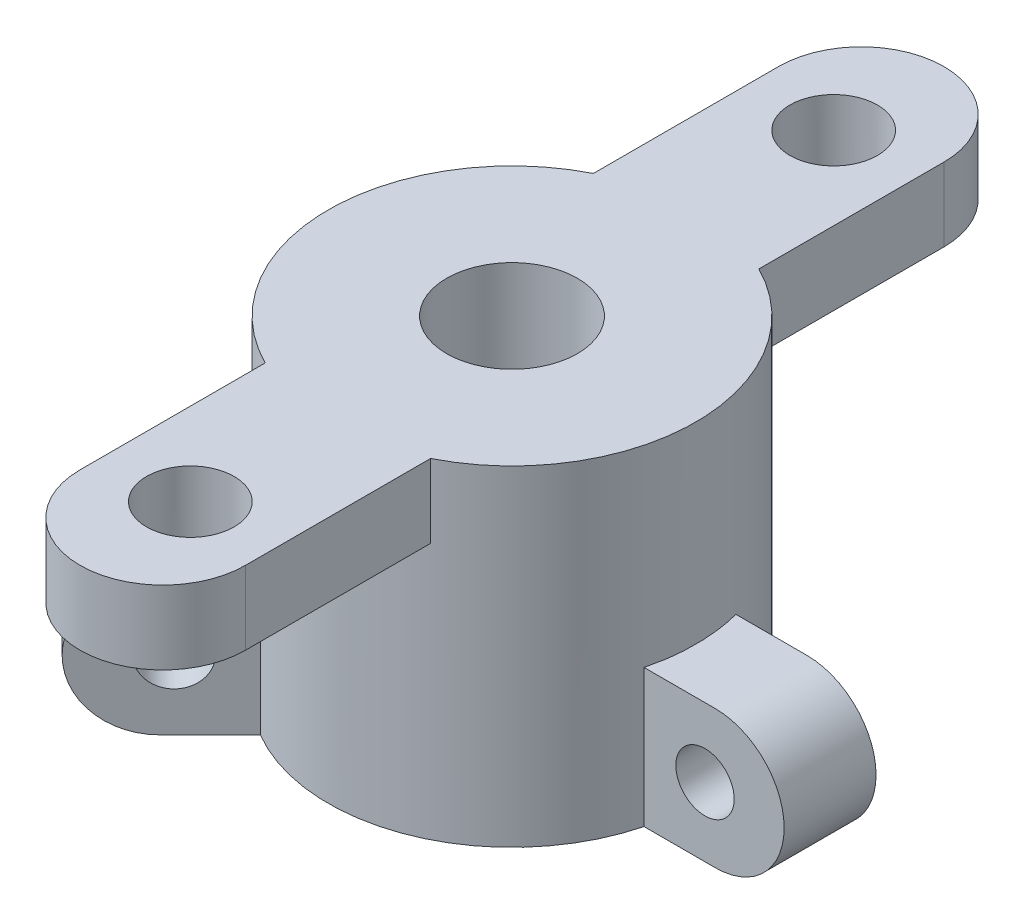
ISO-10303-21;
HEADER;
FILE_DESCRIPTION(('STEP AP214'),'2;1');
FILE_NAME('part.step','',(''),(''),'','','');
FILE_SCHEMA(('AUTOMOTIVE_DESIGN { 1 0 10303 214 1 1 1 1 }'));
ENDSEC;
DATA;
#1=APPLICATION_CONTEXT('core data for automotive mechanical design processes');
#2=APPLICATION_PROTOCOL_DEFINITION('international standard','automotive_design',2000,#1);
#3=PRODUCT_CONTEXT('',#1,'mechanical');
#4=PRODUCT('Part','Part','',(#3));
#5=PRODUCT_RELATED_PRODUCT_CATEGORY('part','',(#4));
#6=PRODUCT_DEFINITION_FORMATION('','',#4);
#7=PRODUCT_DEFINITION_CONTEXT('part definition',#1,'design');
#8=PRODUCT_DEFINITION('design','',#6,#7);
#9=PRODUCT_DEFINITION_SHAPE('','',#8);
#10=(LENGTH_UNIT() NAMED_UNIT(*) SI_UNIT(.MILLI.,.METRE.));
#11=(NAMED_UNIT(*) PLANE_ANGLE_UNIT() SI_UNIT($,.RADIAN.));
#12=(NAMED_UNIT(*) SI_UNIT($,.STERADIAN.) SOLID_ANGLE_UNIT());
#13=UNCERTAINTY_MEASURE_WITH_UNIT(LENGTH_MEASURE(1.E-05),#10,'distance_accuracy_value','');
#14=(GEOMETRIC_REPRESENTATION_CONTEXT(3) GLOBAL_UNCERTAINTY_ASSIGNED_CONTEXT((#13)) GLOBAL_UNIT_ASSIGNED_CONTEXT((#10,
#11,#12)) REPRESENTATION_CONTEXT('',''));
#15=CARTESIAN_POINT('',(0.,0.,0.));
#16=DIRECTION('',(0.,0.,1.));
#17=DIRECTION('',(1.,0.,0.));
#18=AXIS2_PLACEMENT_3D('',#15,#16,#17);
#19=CARTESIAN_POINT('',(0.,23.938,38.));
#20=DIRECTION('',(0.,-1.,0.));
#21=DIRECTION('',(0.,0.,-1.));
#22=AXIS2_PLACEMENT_3D('',#19,#20,#21);
#23=PLANE('',#22);
#24=DIRECTION('',(0.,0.,-1.));
#25=VECTOR('',#24,1.);
#26=CARTESIAN_POINT('',(9.,23.938,38.));
#27=LINE('',#26,#25);
#28=CARTESIAN_POINT('',(9.,23.938,37.9999999999999));
#29=VERTEX_POINT('',#28);
#30=CARTESIAN_POINT('',(9.,23.938,17.8605710994918));
#31=VERTEX_POINT('',#30);
#32=EDGE_CURVE('E397',#29,#31,#27,.T.);
#33=ORIENTED_EDGE('',*,*,#32,.F.);
#34=CARTESIAN_POINT('',(0.,23.938,38.));
#35=DIRECTION('',(0.,-1.,0.));
#36=DIRECTION('',(0.,0.,-1.));
#37=AXIS2_PLACEMENT_3D('',#34,#35,#36);
#38=CIRCLE('',#37,9.);
#39=CARTESIAN_POINT('',(-9.,23.938,38.));
#40=VERTEX_POINT('',#39);
#41=EDGE_CURVE('E387',#29,#40,#38,.T.);
#42=ORIENTED_EDGE('',*,*,#41,.T.);
#43=DIRECTION('',(0.,0.,-1.));
#44=VECTOR('',#43,1.);
#45=CARTESIAN_POINT('',(-9.,23.938,38.));
#46=LINE('',#45,#44);
#47=CARTESIAN_POINT('',(-9.,23.938,17.8605710994918));
#48=VERTEX_POINT('',#47);
#49=EDGE_CURVE('E394',#40,#48,#46,.T.);
#50=ORIENTED_EDGE('',*,*,#49,.T.);
#51=CARTESIAN_POINT('',(0.,23.938,0.));
#52=DIRECTION('',(0.,1.,0.));
#53=DIRECTION('',(0.,0.,1.));
#54=AXIS2_PLACEMENT_3D('',#51,#52,#53);
#55=CIRCLE('',#54,20.);
#56=EDGE_CURVE('E1162',#31,#48,#55,.F.);
#57=ORIENTED_EDGE('',*,*,#56,.F.);
#58=EDGE_LOOP('',(#33,#42,#50,#57));
#59=FACE_BOUND('',#58,.T.);
#60=CARTESIAN_POINT('',(0.,23.938,35.));
#61=DIRECTION('',(0.,-1.,0.));
#62=DIRECTION('',(0.,0.,-1.));
#63=AXIS2_PLACEMENT_3D('',#60,#61,#62);
#64=CIRCLE('',#63,4.7625);
#65=CARTESIAN_POINT('',(0.,23.938,30.2375));
#66=VERTEX_POINT('',#65);
#67=EDGE_CURVE('E1146',#66,#66,#64,.T.);
#68=ORIENTED_EDGE('',*,*,#67,.F.);
#69=EDGE_LOOP('',(#68));
#70=FACE_BOUND('',#69,.T.);
#71=ADVANCED_FACE('F236',(#59,#70),#23,.T.);
#72=CARTESIAN_POINT('',(0.,31.938,0.));
#73=DIRECTION('',(0.,-1.,0.));
#74=DIRECTION('',(0.,0.,-1.));
#75=AXIS2_PLACEMENT_3D('',#72,#73,#74);
#76=CYLINDRICAL_SURFACE('',#75,20.);
#77=CARTESIAN_POINT('',(0.,-4.,0.));
#78=DIRECTION('',(0.,-1.,0.));
#79=DIRECTION('',(0.,0.,-1.));
#80=AXIS2_PLACEMENT_3D('',#77,#78,#79);
#81=CIRCLE('',#80,20.);
#82=CARTESIAN_POINT('',(-10.1575300316963,-4.,-17.2285978435619));
#83=VERTEX_POINT('',#82);
#84=CARTESIAN_POINT('',(19.3649167310371,-4.,-4.99999999999992));
#85=VERTEX_POINT('',#84);
#86=EDGE_CURVE('E796',#83,#85,#81,.T.);
#87=ORIENTED_EDGE('',*,*,#86,.F.);
#88=DIRECTION('',(0.,-1.,0.));
#89=VECTOR('',#88,1.);
#90=CARTESIAN_POINT('',(-10.157530031696,31.9379999999999,-17.2285978435621));
#91=LINE('',#90,#89);
#92=CARTESIAN_POINT('',(-10.1575300316963,11.,-17.228597843562));
#93=VERTEX_POINT('',#92);
#94=EDGE_CURVE('E580',#83,#93,#91,.F.);
#95=ORIENTED_EDGE('',*,*,#94,.T.);
#96=CARTESIAN_POINT('',(-10.1575300316963,11.,-17.228597843562));
#97=CARTESIAN_POINT('',(-10.3962749394541,11.,-17.0878399292447));
#98=CARTESIAN_POINT('',(-10.6320658817667,11.,-16.9421353701807));
#99=CARTESIAN_POINT('',(-11.0973896205973,11.,-16.6410563121272));
#100=CARTESIAN_POINT('',(-11.3269224430615,11.,-16.485681853238));
#101=CARTESIAN_POINT('',(-12.0054672570398,11.,-16.0054888049068));
#102=CARTESIAN_POINT('',(-12.4445781003342,11.,-15.6665106064615));
#103=CARTESIAN_POINT('',(-13.2952062065693,11.,-14.951515331128));
#104=CARTESIAN_POINT('',(-13.7065745813221,11.,-14.5753215947813));
#105=CARTESIAN_POINT('',(-14.4964932952939,11.,-13.7899205573257));
#106=CARTESIAN_POINT('',(-14.8750429890857,11.,-13.3807126072493));
#107=CARTESIAN_POINT('',(-15.6072793229377,11.,-12.5196403901251));
#108=CARTESIAN_POINT('',(-15.9599139962014,11.,-12.0668781906921));
#109=CARTESIAN_POINT('',(-16.4586711171376,11.,-11.3663728549153));
#110=CARTESIAN_POINT('',(-16.6199191419921,11.,-11.1292630339433));
#111=CARTESIAN_POINT('',(-16.9320748980095,11.,-10.648333158931));
#112=CARTESIAN_POINT('',(-17.0829826697693,11.,-10.4045131312409));
#113=CARTESIAN_POINT('',(-17.2285978435618,11.,-10.1575300316966));
#114=B_SPLINE_CURVE_WITH_KNOTS('',3,(#96,#97,#98,#99,#100,#101,#102,#103,#104,#105,#106,#107,
#108,#109,#110,#111,#112,#113),.UNSPECIFIED.,.F.,.F.,(4,2,2,2,2,2,2,2,4),(0.,0.83132443704412,
1.66264542688803,3.32475791851788,4.99517798528058,6.66563089584277,8.38497473877979,
9.24497783649148,10.1049775575454),.UNSPECIFIED.);
#115=CARTESIAN_POINT('',(-17.2285978435618,11.,-10.1575300316965));
#116=VERTEX_POINT('',#115);
#117=EDGE_CURVE('E582',#93,#116,#114,.T.);
#118=ORIENTED_EDGE('',*,*,#117,.T.);
#119=DIRECTION('',(0.,-1.,0.));
#120=VECTOR('',#119,1.);
#121=CARTESIAN_POINT('',(-17.228597843562,31.9379999999999,-10.1575300316963));
#122=LINE('',#121,#120);
#123=CARTESIAN_POINT('',(-17.2285978435618,-4.,-10.1575300316966));
#124=VERTEX_POINT('',#123);
#125=EDGE_CURVE('E577',#124,#116,#122,.F.);
#126=ORIENTED_EDGE('',*,*,#125,.F.);
#127=CARTESIAN_POINT('',(-17.2285978435619,-4.,10.1575300316964));
#128=VERTEX_POINT('',#127);
#129=EDGE_CURVE('E818',#128,#124,#81,.T.);
#130=ORIENTED_EDGE('',*,*,#129,.F.);
#131=DIRECTION('',(0.,-1.,0.));
#132=VECTOR('',#131,1.);
#133=CARTESIAN_POINT('',(-17.2285978435621,31.9379999999999,10.157530031696));
#134=LINE('',#133,#132);
#135=CARTESIAN_POINT('',(-17.2285978435619,11.,10.1575300316963));
#136=VERTEX_POINT('',#135);
#137=EDGE_CURVE('E627',#128,#136,#134,.F.);
#138=ORIENTED_EDGE('',*,*,#137,.T.);
#139=CARTESIAN_POINT('',(-17.2285978435619,11.,10.1575300316963));
#140=CARTESIAN_POINT('',(-17.0878399292446,11.,10.3962749394542));
#141=CARTESIAN_POINT('',(-16.9421353701806,11.,10.6320658817668));
#142=CARTESIAN_POINT('',(-16.6410563121272,11.,11.0973896205973));
#143=CARTESIAN_POINT('',(-16.485681853238,11.,11.3269224430616));
#144=CARTESIAN_POINT('',(-16.0054888049067,11.,12.0054672570399));
#145=CARTESIAN_POINT('',(-15.6665106064614,11.,12.4445781003342));
#146=CARTESIAN_POINT('',(-14.9515153311279,11.,13.2952062065693));
#147=CARTESIAN_POINT('',(-14.5753215947813,11.,13.7065745813221));
#148=CARTESIAN_POINT('',(-13.7899205573256,11.,14.496493295294));
#149=CARTESIAN_POINT('',(-13.3807126072493,11.,14.8750429890858));
#150=CARTESIAN_POINT('',(-12.5196403901251,11.,15.6072793229377));
#151=CARTESIAN_POINT('',(-12.0668781906921,11.,15.9599139962015));
#152=CARTESIAN_POINT('',(-11.3663728549152,11.,16.4586711171376));
#153=CARTESIAN_POINT('',(-11.1292630339432,11.,16.6199191419921));
#154=CARTESIAN_POINT('',(-10.6483331589309,11.,16.9320748980095));
#155=CARTESIAN_POINT('',(-10.4045131312409,11.,17.0829826697694));
#156=CARTESIAN_POINT('',(-10.1575300316965,11.,17.2285978435618));
#157=B_SPLINE_CURVE_WITH_KNOTS('',3,(#139,#140,#141,#142,#143,#144,#145,#146,#147,#148,#149,
#150,#151,#152,#153,#154,#155,#156),.UNSPECIFIED.,.F.,.F.,(4,2,2,2,2,2,2,2,4),(0.,
0.83132443704412,1.66264542688803,3.32475791851788,4.99517798528058,6.66563089584278,
8.38497473877979,9.24497783649148,10.1049775575454),.UNSPECIFIED.);
#158=CARTESIAN_POINT('',(-10.1575300316964,11.,17.2285978435618));
#159=VERTEX_POINT('',#158);
#160=EDGE_CURVE('E629',#136,#159,#157,.T.);
#161=ORIENTED_EDGE('',*,*,#160,.T.);
#162=DIRECTION('',(0.,-1.,0.));
#163=VECTOR('',#162,1.);
#164=CARTESIAN_POINT('',(-10.1575300316962,31.9379999999999,17.228597843562));
#165=LINE('',#164,#163);
#166=CARTESIAN_POINT('',(-10.1575300316966,-4.,17.2285978435618));
#167=VERTEX_POINT('',#166);
#168=EDGE_CURVE('E630',#167,#159,#165,.F.);
#169=ORIENTED_EDGE('',*,*,#168,.F.);
#170=CARTESIAN_POINT('',(19.3649167310371,-4.,4.99999999999992));
#171=VERTEX_POINT('',#170);
#172=EDGE_CURVE('E809',#171,#167,#81,.T.);
#173=ORIENTED_EDGE('',*,*,#172,.F.);
#174=DIRECTION('',(0.,-1.,0.));
#175=VECTOR('',#174,1.);
#176=CARTESIAN_POINT('',(19.364916731037,31.9379999999999,5.00000000000032));
#177=LINE('',#176,#175);
#178=CARTESIAN_POINT('',(19.3649167310371,11.,5.));
#179=VERTEX_POINT('',#178);
#180=EDGE_CURVE('E781',#171,#179,#177,.F.);
#181=ORIENTED_EDGE('',*,*,#180,.T.);
#182=CARTESIAN_POINT('',(19.3649167310371,11.,5.));
#183=CARTESIAN_POINT('',(19.434203998567,11.,4.73165098103121));
#184=CARTESIAN_POINT('',(19.4979046910546,11.,4.46189292501569));
#185=CARTESIAN_POINT('',(19.6140432186059,11.,3.91996431021864));
#186=CARTESIAN_POINT('',(19.6664811003715,11.,3.64779376144553));
#187=CARTESIAN_POINT('',(19.8067369789209,11.,2.82844236138886));
#188=CARTESIAN_POINT('',(19.8775414511118,11.,2.2782503236078));
#189=CARTESIAN_POINT('',(19.9734483455938,11.,1.17118741371642));
#190=CARTESIAN_POINT('',(19.9983205709366,11.,0.614296904352441));
#191=CARTESIAN_POINT('',(20.0015150506364,11.,-0.499622374419079));
#192=CARTESIAN_POINT('',(19.9798363897183,11.,-1.0566511463298));
#193=CARTESIAN_POINT('',(19.8887356629963,11.,-2.18329042724753));
#194=CARTESIAN_POINT('',(19.8179348102586,11.,-2.75279201747784));
#195=CARTESIAN_POINT('',(19.6752772794524,11.,-3.60079863304204));
#196=CARTESIAN_POINT('',(19.6216348889847,11.,-3.88248016716479));
#197=CARTESIAN_POINT('',(19.5022935649546,11.,-4.44327639492751));
#198=CARTESIAN_POINT('',(19.4365946787311,11.,-4.72239109864142));
#199=CARTESIAN_POINT('',(19.3649167310371,11.,-5.));
#200=B_SPLINE_CURVE_WITH_KNOTS('',3,(#182,#183,#184,#185,#186,#187,#188,#189,#190,#191,#192,
#193,#194,#195,#196,#197,#198,#199),.UNSPECIFIED.,.F.,.F.,(4,2,2,2,2,2,2,2,4),(0.,
0.831324437044121,1.66264542688803,3.32475791851788,4.99517798528058,6.66563089584278,
8.38497473877979,9.24497783649149,10.1049775575454),.UNSPECIFIED.);
#201=CARTESIAN_POINT('',(19.364916731037,11.,-5.00000000000004));
#202=VERTEX_POINT('',#201);
#203=EDGE_CURVE('E783',#179,#202,#200,.T.);
#204=ORIENTED_EDGE('',*,*,#203,.T.);
#205=DIRECTION('',(0.,-1.,0.));
#206=VECTOR('',#205,1.);
#207=CARTESIAN_POINT('',(19.364916731037,31.9379999999999,-5.00000000000032));
#208=LINE('',#207,#206);
#209=EDGE_CURVE('E780',#85,#202,#208,.F.);
#210=ORIENTED_EDGE('',*,*,#209,.F.);
#211=EDGE_LOOP('',(#87,#95,#118,#126,#130,#138,#161,#169,#173,#181,#204,#210));
#212=FACE_BOUND('',#211,.T.);
#213=DIRECTION('',(0.,-1.,0.));
#214=VECTOR('',#213,1.);
#215=CARTESIAN_POINT('',(9.,31.938,17.8605710994918));
#216=LINE('',#215,#214);
#217=CARTESIAN_POINT('',(9.,31.938,17.8605710994918));
#218=VERTEX_POINT('',#217);
#219=EDGE_CURVE('E400',#31,#218,#216,.F.);
#220=ORIENTED_EDGE('',*,*,#219,.F.);
#221=ORIENTED_EDGE('',*,*,#56,.T.);
#222=DIRECTION('',(0.,-1.,0.));
#223=VECTOR('',#222,1.);
#224=CARTESIAN_POINT('',(-9.,31.938,17.8605710994918));
#225=LINE('',#224,#223);
#226=CARTESIAN_POINT('',(-9.,31.938,17.8605710994918));
#227=VERTEX_POINT('',#226);
#228=EDGE_CURVE('E254',#48,#227,#225,.F.);
#229=ORIENTED_EDGE('',*,*,#228,.T.);
#230=CARTESIAN_POINT('',(0.,31.938,0.));
#231=DIRECTION('',(0.,1.,0.));
#232=DIRECTION('',(0.,0.,1.));
#233=AXIS2_PLACEMENT_3D('',#230,#231,#232);
#234=CIRCLE('',#233,20.);
#235=CARTESIAN_POINT('',(-9.,31.938,-17.8605710994918));
#236=VERTEX_POINT('',#235);
#237=EDGE_CURVE('E12',#236,#227,#234,.T.);
#238=ORIENTED_EDGE('',*,*,#237,.F.);
#239=DIRECTION('',(0.,-1.,0.));
#240=VECTOR('',#239,1.);
#241=CARTESIAN_POINT('',(-9.,31.938,-17.8605710994918));
#242=LINE('',#241,#240);
#243=CARTESIAN_POINT('',(-9.,23.938,-17.8605710994918));
#244=VERTEX_POINT('',#243);
#245=EDGE_CURVE('E262',#244,#236,#242,.F.);
#246=ORIENTED_EDGE('',*,*,#245,.F.);
#247=CARTESIAN_POINT('',(0.,23.938,0.));
#248=DIRECTION('',(0.,-1.,0.));
#249=DIRECTION('',(0.,0.,-1.));
#250=AXIS2_PLACEMENT_3D('',#247,#248,#249);
#251=CIRCLE('',#250,20.);
#252=CARTESIAN_POINT('',(9.,23.938,-17.8605710994918));
#253=VERTEX_POINT('',#252);
#254=EDGE_CURVE('E407',#253,#244,#251,.F.);
#255=ORIENTED_EDGE('',*,*,#254,.F.);
#256=DIRECTION('',(0.,-1.,0.));
#257=VECTOR('',#256,1.);
#258=CARTESIAN_POINT('',(9.,31.938,-17.8605710994918));
#259=LINE('',#258,#257);
#260=CARTESIAN_POINT('',(9.,31.938,-17.8605710994918));
#261=VERTEX_POINT('',#260);
#262=EDGE_CURVE('E408',#253,#261,#259,.F.);
#263=ORIENTED_EDGE('',*,*,#262,.T.);
#264=EDGE_CURVE('E246',#218,#261,#234,.T.);
#265=ORIENTED_EDGE('',*,*,#264,.F.);
#266=EDGE_LOOP('',(#220,#221,#229,#238,#246,#255,#263,#265));
#267=FACE_BOUND('',#266,.T.);
#268=ADVANCED_FACE('F238',(#212,#267),#76,.T.);
#269=CARTESIAN_POINT('',(0.,31.938,0.));
#270=DIRECTION('',(0.,1.,0.));
#271=DIRECTION('',(0.,0.,1.));
#272=AXIS2_PLACEMENT_3D('',#269,#270,#271);
#273=PLANE('',#272);
#274=CARTESIAN_POINT('',(0.,31.938,35.));
#275=DIRECTION('',(0.,1.,0.));
#276=DIRECTION('',(0.,0.,1.));
#277=AXIS2_PLACEMENT_3D('',#274,#275,#276);
#278=CIRCLE('',#277,4.7625);
#279=CARTESIAN_POINT('',(0.,31.938,39.7625));
#280=VERTEX_POINT('',#279);
#281=EDGE_CURVE('E1149',#280,#280,#278,.T.);
#282=ORIENTED_EDGE('',*,*,#281,.F.);
#283=EDGE_LOOP('',(#282));
#284=FACE_BOUND('',#283,.T.);
#285=CARTESIAN_POINT('',(0.,31.938,38.));
#286=DIRECTION('',(0.,-1.,0.));
#287=DIRECTION('',(0.,0.,-1.));
#288=AXIS2_PLACEMENT_3D('',#285,#286,#287);
#289=CIRCLE('',#288,9.);
#290=CARTESIAN_POINT('',(9.,31.938,37.9999999999999));
#291=VERTEX_POINT('',#290);
#292=CARTESIAN_POINT('',(-9.,31.938,38.));
#293=VERTEX_POINT('',#292);
#294=EDGE_CURVE('E377',#291,#293,#289,.T.);
#295=ORIENTED_EDGE('',*,*,#294,.F.);
#296=DIRECTION('',(0.,0.,-1.));
#297=VECTOR('',#296,1.);
#298=CARTESIAN_POINT('',(9.,31.938,38.));
#299=LINE('',#298,#297);
#300=EDGE_CURVE('E393',#291,#218,#299,.T.);
#301=ORIENTED_EDGE('',*,*,#300,.T.);
#302=ORIENTED_EDGE('',*,*,#264,.T.);
#303=DIRECTION('',(0.,0.,1.));
#304=VECTOR('',#303,1.);
#305=CARTESIAN_POINT('',(9.,31.938,-38.));
#306=LINE('',#305,#304);
#307=CARTESIAN_POINT('',(9.,31.938,-38.));
#308=VERTEX_POINT('',#307);
#309=EDGE_CURVE('E419',#308,#261,#306,.T.);
#310=ORIENTED_EDGE('',*,*,#309,.F.);
#311=CARTESIAN_POINT('',(0.,31.938,-38.));
#312=DIRECTION('',(0.,1.,0.));
#313=DIRECTION('',(0.,0.,1.));
#314=AXIS2_PLACEMENT_3D('',#311,#312,#313);
#315=CIRCLE('',#314,9.);
#316=CARTESIAN_POINT('',(-9.,31.938,-38.));
#317=VERTEX_POINT('',#316);
#318=EDGE_CURVE('E1157',#308,#317,#315,.T.);
#319=ORIENTED_EDGE('',*,*,#318,.T.);
#320=DIRECTION('',(0.,0.,1.));
#321=VECTOR('',#320,1.);
#322=CARTESIAN_POINT('',(-9.,31.938,-38.));
#323=LINE('',#322,#321);
#324=EDGE_CURVE('E422',#317,#236,#323,.T.);
#325=ORIENTED_EDGE('',*,*,#324,.T.);
#326=ORIENTED_EDGE('',*,*,#237,.T.);
#327=DIRECTION('',(0.,0.,-1.));
#328=VECTOR('',#327,1.);
#329=CARTESIAN_POINT('',(-9.,31.938,38.));
#330=LINE('',#329,#328);
#331=EDGE_CURVE('E389',#293,#227,#330,.T.);
#332=ORIENTED_EDGE('',*,*,#331,.F.);
#333=EDGE_LOOP('',(#295,#301,#302,#310,#319,#325,#326,#332));
#334=FACE_BOUND('',#333,.T.);
#335=CARTESIAN_POINT('',(0.,31.938,-35.));
#336=DIRECTION('',(0.,1.,0.));
#337=DIRECTION('',(0.,0.,-1.));
#338=AXIS2_PLACEMENT_3D('',#335,#336,#337);
#339=CIRCLE('',#338,4.7625);
#340=CARTESIAN_POINT('',(0.,31.938,-39.7625));
#341=VERTEX_POINT('',#340);
#342=EDGE_CURVE('E1150',#341,#341,#339,.T.);
#343=ORIENTED_EDGE('',*,*,#342,.F.);
#344=EDGE_LOOP('',(#343));
#345=FACE_BOUND('',#344,.T.);
#346=CARTESIAN_POINT('',(0.,31.938,0.));
#347=DIRECTION('',(0.,1.,0.));
#348=DIRECTION('',(0.,0.,1.));
#349=AXIS2_PLACEMENT_3D('',#346,#347,#348);
#350=CIRCLE('',#349,7.112);
#351=CARTESIAN_POINT('',(0.,31.938,7.112));
#352=VERTEX_POINT('',#351);
#353=EDGE_CURVE('E803',#352,#352,#350,.T.);
#354=ORIENTED_EDGE('',*,*,#353,.F.);
#355=EDGE_LOOP('',(#354));
#356=FACE_BOUND('',#355,.T.);
#357=ADVANCED_FACE('F390',(#284,#334,#345,#356),#273,.T.);
#358=CARTESIAN_POINT('',(0.,31.938,0.));
#359=DIRECTION('',(0.,-1.,0.));
#360=DIRECTION('',(0.,0.,-1.));
#361=AXIS2_PLACEMENT_3D('',#358,#359,#360);
#362=CYLINDRICAL_SURFACE('',#361,7.112);
#363=ORIENTED_EDGE('',*,*,#353,.T.);
#364=EDGE_LOOP('',(#363));
#365=FACE_BOUND('',#364,.T.);
#366=CARTESIAN_POINT('',(0.,-4.,0.));
#367=DIRECTION('',(0.,-1.,0.));
#368=DIRECTION('',(0.,0.,-1.));
#369=AXIS2_PLACEMENT_3D('',#366,#367,#368);
#370=CIRCLE('',#369,7.112);
#371=CARTESIAN_POINT('',(0.,-4.,-7.112));
#372=VERTEX_POINT('',#371);
#373=EDGE_CURVE('E428',#372,#372,#370,.T.);
#374=ORIENTED_EDGE('',*,*,#373,.T.);
#375=EDGE_LOOP('',(#374));
#376=FACE_BOUND('',#375,.T.);
#377=ADVANCED_FACE('F1031',(#365,#376),#362,.F.);
#378=CARTESIAN_POINT('',(0.,-4.,0.));
#379=DIRECTION('',(0.,-1.,0.));
#380=DIRECTION('',(0.,0.,-1.));
#381=AXIS2_PLACEMENT_3D('',#378,#379,#380);
#382=PLANE('',#381);
#383=ORIENTED_EDGE('',*,*,#373,.F.);
#384=EDGE_LOOP('',(#383));
#385=FACE_BOUND('',#384,.T.);
#386=EDGE_CURVE('E821',#124,#83,#81,.T.);
#387=ORIENTED_EDGE('',*,*,#386,.T.);
#388=ORIENTED_EDGE('',*,*,#86,.T.);
#389=EDGE_CURVE('E805',#85,#171,#81,.T.);
#390=ORIENTED_EDGE('',*,*,#389,.T.);
#391=ORIENTED_EDGE('',*,*,#172,.T.);
#392=EDGE_CURVE('E816',#167,#128,#81,.T.);
#393=ORIENTED_EDGE('',*,*,#392,.T.);
#394=ORIENTED_EDGE('',*,*,#129,.T.);
#395=EDGE_LOOP('',(#387,#388,#390,#391,#393,#394));
#396=FACE_BOUND('',#395,.T.);
#397=ADVANCED_FACE('F668',(#385,#396),#382,.T.);
#398=CARTESIAN_POINT('',(7.112,11.,5.));
#399=CARTESIAN_POINT('',(7.112,11.,-5.));
#400=CARTESIAN_POINT('',(8.77866666666667,11.,5.));
#401=CARTESIAN_POINT('',(8.77866666666667,11.,-5.));
#402=CARTESIAN_POINT('',(12.112,11.,5.));
#403=CARTESIAN_POINT('',(12.112,11.,-5.));
#404=CARTESIAN_POINT('',(17.112,11.,5.00000000000001));
#405=CARTESIAN_POINT('',(17.112,11.,-5.00000000000001));
#406=CARTESIAN_POINT('',(22.112,11.,5.));
#407=CARTESIAN_POINT('',(22.112,11.,-5.));
#408=CARTESIAN_POINT('',(25.4452709893923,11.,5.));
#409=CARTESIAN_POINT('',(25.4452709893923,11.,-5.));
#410=CARTESIAN_POINT('',(28.093641850513,11.,5.));
#411=CARTESIAN_POINT('',(28.093641850513,11.,-5.));
#412=CARTESIAN_POINT('',(30.0568194840168,10.609942372812,5.));
#413=CARTESIAN_POINT('',(30.0568194840168,10.609942372812,-5.));
#414=CARTESIAN_POINT('',(32.5536657783574,8.94146967651626,5.00000000000001));
#415=CARTESIAN_POINT('',(32.5536657783574,8.94146967651626,-5.00000000000001));
#416=CARTESIAN_POINT('',(34.2216922276716,6.44495495577153,5.));
#417=CARTESIAN_POINT('',(34.2216922276716,6.44495495577153,-5.));
#418=CARTESIAN_POINT('',(34.8075531412833,3.50000000000001,5.));
#419=CARTESIAN_POINT('',(34.8075531412833,3.50000000000001,-5.));
#420=CARTESIAN_POINT('',(34.2216922276716,0.555045044228452,5.));
#421=CARTESIAN_POINT('',(34.2216922276716,0.555045044228452,-5.));
#422=CARTESIAN_POINT('',(32.5536657783574,-1.94146967651625,5.));
#423=CARTESIAN_POINT('',(32.5536657783574,-1.94146967651625,-5.));
#424=CARTESIAN_POINT('',(30.0568194840168,-3.60994237281204,5.));
#425=CARTESIAN_POINT('',(30.0568194840168,-3.60994237281204,-5.));
#426=CARTESIAN_POINT('',(28.093641850513,-4.,5.));
#427=CARTESIAN_POINT('',(28.093641850513,-4.,-5.));
#428=CARTESIAN_POINT('',(25.4452709893923,-4.,5.));
#429=CARTESIAN_POINT('',(25.4452709893923,-4.,-5.));
#430=CARTESIAN_POINT('',(22.112,-4.,5.));
#431=CARTESIAN_POINT('',(22.112,-4.,-5.));
#432=CARTESIAN_POINT('',(17.112,-4.00000000000001,5.));
#433=CARTESIAN_POINT('',(17.112,-4.00000000000001,-5.));
#434=CARTESIAN_POINT('',(12.112,-4.,5.));
#435=CARTESIAN_POINT('',(12.112,-4.,-5.));
#436=CARTESIAN_POINT('',(8.77866666666667,-4.,5.));
#437=CARTESIAN_POINT('',(8.77866666666667,-4.,-5.));
#438=CARTESIAN_POINT('',(7.112,-4.,5.));
#439=CARTESIAN_POINT('',(7.112,-4.,-5.));
#440=B_SPLINE_SURFACE_WITH_KNOTS('',3,1,((#398,#399),(#400,#401),(#402,#403),(#404,#405),(#406,
#407),(#408,#409),(#410,#411),(#412,#413),(#414,#415),(#416,#417),(#418,#419),(#420,#421),(#422,
#423),(#424,#425),(#426,#427),(#428,#429),(#430,#431),(#432,#433),(#434,#435),(#436,#437),(#438,
#439)),.UNSPECIFIED.,.F.,.F.,.F.,(4,1,1,1,2,1,1,1,1,1,1,1,2,1,1,1,4),(2,2),(0.,
0.078667655419602,0.157335310839204,0.236002966258806,0.314670621678408,0.361002966258806,
0.407335310839204,0.453667655419602,0.5,0.546332344580398,0.592664689160796,0.638997033741194,
0.685329378321592,0.763997033741194,0.842664689160796,0.921332344580398,1.),(0.,1.),.UNSPECIFIED.);
#441=DIRECTION('',(1.,0.,0.));
#442=VECTOR('',#441,1.);
#443=CARTESIAN_POINT('',(27.112,11.,5.));
#444=LINE('',#443,#442);
#445=CARTESIAN_POINT('',(27.112,11.,5.));
#446=VERTEX_POINT('',#445);
#447=EDGE_CURVE('E732',#179,#446,#444,.T.);
#448=CARTESIAN_POINT('',(27.112,3.5,5.));
#449=DIRECTION('',(0.,0.,1.));
#450=DIRECTION('',(1.,0.,0.));
#451=AXIS2_PLACEMENT_3D('',#448,#449,#450);
#452=CIRCLE('',#451,7.5);
#453=CARTESIAN_POINT('',(27.1119999999905,-4.,5.));
#454=VERTEX_POINT('',#453);
#455=EDGE_CURVE('E731',#446,#454,#452,.F.);
#456=DIRECTION('',(-1.,0.,0.));
#457=VECTOR('',#456,1.);
#458=CARTESIAN_POINT('',(7.112,-4.,5.));
#459=LINE('',#458,#457);
#460=EDGE_CURVE('E727',#454,#171,#459,.T.);
#461=DIRECTION('',(-1.,0.,0.));
#462=VECTOR('',#461,1.);
#463=CARTESIAN_POINT('',(7.112,-4.,-5.));
#464=LINE('',#463,#462);
#465=CARTESIAN_POINT('',(27.1119999999905,-4.,-5.));
#466=VERTEX_POINT('',#465);
#467=EDGE_CURVE('E644',#466,#85,#464,.T.);
#468=CARTESIAN_POINT('',(27.112,3.5,-5.));
#469=DIRECTION('',(0.,0.,1.));
#470=DIRECTION('',(1.,0.,0.));
#471=AXIS2_PLACEMENT_3D('',#468,#469,#470);
#472=CIRCLE('',#471,7.5);
#473=CARTESIAN_POINT('',(27.112,11.,-5.));
#474=VERTEX_POINT('',#473);
#475=EDGE_CURVE('E724',#474,#466,#472,.F.);
#476=DIRECTION('',(1.,0.,0.));
#477=VECTOR('',#476,1.);
#478=CARTESIAN_POINT('',(27.112,11.,-5.));
#479=LINE('',#478,#477);
#480=EDGE_CURVE('E725',#202,#474,#479,.T.);
#481=ORIENTED_EDGE('',*,*,#203,.F.);
#482=ORIENTED_EDGE('',*,*,#447,.T.);
#483=ORIENTED_EDGE('',*,*,#455,.T.);
#484=ORIENTED_EDGE('',*,*,#460,.T.);
#485=ORIENTED_EDGE('',*,*,#389,.F.);
#486=ORIENTED_EDGE('',*,*,#467,.F.);
#487=ORIENTED_EDGE('',*,*,#475,.F.);
#488=ORIENTED_EDGE('',*,*,#480,.F.);
#489=EDGE_LOOP('',(#481,#482,#483,#484,#485,#486,#487,#488));
#490=FACE_BOUND('',#489,.T.);
#491=ADVANCED_FACE('F656',(#490),#440,.T.);
#492=CARTESIAN_POINT('',(34.6122661700794,3.5,5.));
#493=DIRECTION('',(0.,0.,1.));
#494=DIRECTION('',(0.,-1.,0.));
#495=AXIS2_PLACEMENT_3D('',#492,#493,#494);
#496=PLANE('',#495);
#497=CARTESIAN_POINT('',(26.,3.49999999999996,4.99999999999996));
#498=DIRECTION('',(0.,0.,1.));
#499=DIRECTION('',(1.,0.,0.));
#500=AXIS2_PLACEMENT_3D('',#497,#498,#499);
#501=CIRCLE('',#500,3.175);
#502=CARTESIAN_POINT('',(29.175,3.49999999999996,4.99999999999996));
#503=VERTEX_POINT('',#502);
#504=EDGE_CURVE('E634',#503,#503,#501,.T.);
#505=ORIENTED_EDGE('',*,*,#504,.F.);
#506=EDGE_LOOP('',(#505));
#507=FACE_BOUND('',#506,.T.);
#508=ORIENTED_EDGE('',*,*,#180,.F.);
#509=ORIENTED_EDGE('',*,*,#460,.F.);
#510=ORIENTED_EDGE('',*,*,#455,.F.);
#511=ORIENTED_EDGE('',*,*,#447,.F.);
#512=EDGE_LOOP('',(#508,#509,#510,#511));
#513=FACE_BOUND('',#512,.T.);
#514=ADVANCED_FACE('F667',(#507,#513),#496,.T.);
#515=CARTESIAN_POINT('',(34.6122661700794,3.5,-5.));
#516=DIRECTION('',(0.,0.,1.));
#517=DIRECTION('',(0.,-1.,0.));
#518=AXIS2_PLACEMENT_3D('',#515,#516,#517);
#519=PLANE('',#518);
#520=CARTESIAN_POINT('',(26.,3.49999999999996,-5.00000000000004));
#521=DIRECTION('',(0.,0.,1.));
#522=DIRECTION('',(1.,0.,0.));
#523=AXIS2_PLACEMENT_3D('',#520,#521,#522);
#524=CIRCLE('',#523,3.175);
#525=CARTESIAN_POINT('',(29.175,3.49999999999996,-5.00000000000004));
#526=VERTEX_POINT('',#525);
#527=EDGE_CURVE('E641',#526,#526,#524,.T.);
#528=ORIENTED_EDGE('',*,*,#527,.T.);
#529=EDGE_LOOP('',(#528));
#530=FACE_BOUND('',#529,.T.);
#531=ORIENTED_EDGE('',*,*,#467,.T.);
#532=ORIENTED_EDGE('',*,*,#209,.T.);
#533=ORIENTED_EDGE('',*,*,#480,.T.);
#534=ORIENTED_EDGE('',*,*,#475,.T.);
#535=EDGE_LOOP('',(#531,#532,#533,#534));
#536=FACE_BOUND('',#535,.T.);
#537=ADVANCED_FACE('F740',(#530,#536),#519,.F.);
#538=CARTESIAN_POINT('',(26.,3.49999999999996,-5.00000000000004));
#539=DIRECTION('',(0.,0.,1.));
#540=DIRECTION('',(1.,0.,0.));
#541=AXIS2_PLACEMENT_3D('',#538,#539,#540);
#542=CYLINDRICAL_SURFACE('',#541,3.175);
#543=ORIENTED_EDGE('',*,*,#527,.F.);
#544=EDGE_LOOP('',(#543));
#545=FACE_BOUND('',#544,.T.);
#546=ORIENTED_EDGE('',*,*,#504,.T.);
#547=EDGE_LOOP('',(#546));
#548=FACE_BOUND('',#547,.T.);
#549=ADVANCED_FACE('F670',(#545,#548),#542,.F.);
#550=CARTESIAN_POINT('',(-8.56447733373147,11.,1.49340952186594));
#551=CARTESIAN_POINT('',(-1.49340952186603,11.,8.56447733373146));
#552=CARTESIAN_POINT('',(-9.74298863570906,11.,2.67192082384352));
#553=CARTESIAN_POINT('',(-2.67192082384362,11.,9.74298863570903));
#554=CARTESIAN_POINT('',(-12.1000112396642,11.,5.02894342779866));
#555=CARTESIAN_POINT('',(-5.02894342779879,11.,12.1000112396642));
#556=CARTESIAN_POINT('',(-15.635545145597,11.,8.56447733373137));
#557=CARTESIAN_POINT('',(-8.56447733373154,11.,15.6355451455969));
#558=CARTESIAN_POINT('',(-19.1710790515297,11.,12.1000112396641));
#559=CARTESIAN_POINT('',(-12.1000112396643,11.,19.1710790515296));
#560=CARTESIAN_POINT('',(-21.5280575716615,11.,14.4569897597958));
#561=CARTESIAN_POINT('',(-14.456989759796,11.,21.5280575716613));
#562=CARTESIAN_POINT('',(-23.4007385666568,11.,16.3296707547911));
#563=CARTESIAN_POINT('',(-16.3296707547913,11.,23.4007385666566));
#564=CARTESIAN_POINT('',(-24.7889147839811,10.609942372812,17.7178469721154));
#565=CARTESIAN_POINT('',(-17.7178469721157,10.609942372812,24.7889147839809));
#566=CARTESIAN_POINT('',(-26.5544517302898,8.94146967651626,19.4833839184241));
#567=CARTESIAN_POINT('',(-19.4833839184244,8.94146967651626,26.5544517302896));
#568=CARTESIAN_POINT('',(-27.7339245437984,6.44495495577153,20.6628567319327));
#569=CARTESIAN_POINT('',(-20.6628567319329,6.44495495577153,27.7339245437982));
#570=CARTESIAN_POINT('',(-28.1481907686454,3.50000000000001,21.0771229567797));
#571=CARTESIAN_POINT('',(-21.07712295678,3.50000000000001,28.1481907686452));
#572=CARTESIAN_POINT('',(-27.7339245437984,0.555045044228452,20.6628567319326));
#573=CARTESIAN_POINT('',(-20.6628567319329,0.555045044228452,27.7339245437982));
#574=CARTESIAN_POINT('',(-26.5544517302898,-1.94146967651625,19.4833839184241));
#575=CARTESIAN_POINT('',(-19.4833839184244,-1.94146967651625,26.5544517302896));
#576=CARTESIAN_POINT('',(-24.7889147839811,-3.60994237281204,17.7178469721154));
#577=CARTESIAN_POINT('',(-17.7178469721157,-3.60994237281204,24.7889147839809));
#578=CARTESIAN_POINT('',(-23.4007385666568,-4.,16.3296707547911));
#579=CARTESIAN_POINT('',(-16.3296707547913,-4.,23.4007385666566));
#580=CARTESIAN_POINT('',(-21.5280575716615,-4.,14.4569897597958));
#581=CARTESIAN_POINT('',(-14.456989759796,-4.,21.5280575716613));
#582=CARTESIAN_POINT('',(-19.1710790515297,-4.,12.1000112396641));
#583=CARTESIAN_POINT('',(-12.1000112396643,-4.,19.1710790515296));
#584=CARTESIAN_POINT('',(-15.635545145597,-4.00000000000001,8.56447733373139));
#585=CARTESIAN_POINT('',(-8.56447733373155,-4.00000000000001,15.6355451455969));
#586=CARTESIAN_POINT('',(-12.1000112396642,-4.,5.02894342779866));
#587=CARTESIAN_POINT('',(-5.02894342779879,-4.,12.1000112396642));
#588=CARTESIAN_POINT('',(-9.74298863570906,-4.,2.67192082384352));
#589=CARTESIAN_POINT('',(-2.67192082384362,-4.,9.74298863570903));
#590=CARTESIAN_POINT('',(-8.56447733373147,-4.,1.49340952186594));
#591=CARTESIAN_POINT('',(-1.49340952186603,-4.,8.56447733373146));
#592=B_SPLINE_SURFACE_WITH_KNOTS('',3,1,((#550,#551),(#552,#553),(#554,#555),(#556,#557),(#558,
#559),(#560,#561),(#562,#563),(#564,#565),(#566,#567),(#568,#569),(#570,#571),(#572,#573),(#574,
#575),(#576,#577),(#578,#579),(#580,#581),(#582,#583),(#584,#585),(#586,#587),(#588,#589),(#590,
#591)),.UNSPECIFIED.,.F.,.F.,.F.,(4,1,1,1,2,1,1,1,1,1,1,1,2,1,1,1,4),(2,2),(0.,
0.078667655419602,0.157335310839204,0.236002966258806,0.314670621678408,0.361002966258806,
0.407335310839204,0.453667655419602,0.5,0.546332344580398,0.592664689160796,0.638997033741194,
0.685329378321592,0.763997033741194,0.842664689160796,0.921332344580398,1.),(0.,1.),.UNSPECIFIED.);
#593=DIRECTION('',(-0.707106781186551,0.,0.707106781186544));
#594=VECTOR('',#593,1.);
#595=CARTESIAN_POINT('',(-22.7066129574625,11.,15.6355451455968));
#596=LINE('',#595,#594);
#597=CARTESIAN_POINT('',(-22.7066129574625,11.,15.6355451455968));
#598=VERTEX_POINT('',#597);
#599=EDGE_CURVE('E620',#136,#598,#596,.T.);
#600=CARTESIAN_POINT('',(-22.7066129574625,3.5,15.6355451455968));
#601=DIRECTION('',(-0.707106781186544,0.,-0.707106781186551));
#602=DIRECTION('',(-0.707106781186551,0.,0.707106781186544));
#603=AXIS2_PLACEMENT_3D('',#600,#601,#602);
#604=CIRCLE('',#603,7.5);
#605=CARTESIAN_POINT('',(-22.7066129574558,-4.,15.6355451455901));
#606=VERTEX_POINT('',#605);
#607=EDGE_CURVE('E893',#598,#606,#604,.F.);
#608=DIRECTION('',(0.707106781186551,0.,-0.707106781186544));
#609=VECTOR('',#608,1.);
#610=CARTESIAN_POINT('',(-8.56447733373147,-4.,1.49340952186594));
#611=LINE('',#610,#609);
#612=EDGE_CURVE('E887',#606,#128,#611,.T.);
#613=DIRECTION('',(0.707106781186551,0.,-0.707106781186544));
#614=VECTOR('',#613,1.);
#615=CARTESIAN_POINT('',(-1.49340952186603,-4.,8.56447733373146));
#616=LINE('',#615,#614);
#617=CARTESIAN_POINT('',(-15.6355451455904,-4.,22.7066129574556));
#618=VERTEX_POINT('',#617);
#619=EDGE_CURVE('E595',#618,#167,#616,.T.);
#620=CARTESIAN_POINT('',(-15.6355451455971,3.5,22.7066129574623));
#621=DIRECTION('',(-0.707106781186544,0.,-0.707106781186551));
#622=DIRECTION('',(-0.707106781186551,0.,0.707106781186544));
#623=AXIS2_PLACEMENT_3D('',#620,#621,#622);
#624=CIRCLE('',#623,7.5);
#625=CARTESIAN_POINT('',(-15.6355451455971,11.,22.7066129574623));
#626=VERTEX_POINT('',#625);
#627=EDGE_CURVE('E955',#626,#618,#624,.F.);
#628=DIRECTION('',(-0.707106781186551,0.,0.707106781186544));
#629=VECTOR('',#628,1.);
#630=CARTESIAN_POINT('',(-15.6355451455971,11.,22.7066129574623));
#631=LINE('',#630,#629);
#632=EDGE_CURVE('E895',#159,#626,#631,.T.);
#633=ORIENTED_EDGE('',*,*,#160,.F.);
#634=ORIENTED_EDGE('',*,*,#599,.T.);
#635=ORIENTED_EDGE('',*,*,#607,.T.);
#636=ORIENTED_EDGE('',*,*,#612,.T.);
#637=ORIENTED_EDGE('',*,*,#392,.F.);
#638=ORIENTED_EDGE('',*,*,#619,.F.);
#639=ORIENTED_EDGE('',*,*,#627,.F.);
#640=ORIENTED_EDGE('',*,*,#632,.F.);
#641=EDGE_LOOP('',(#633,#634,#635,#636,#637,#638,#639,#640));
#642=FACE_BOUND('',#641,.T.);
#643=ADVANCED_FACE('F544',(#642),#592,.T.);
#644=CARTESIAN_POINT('',(-28.0101020270297,3.5,20.939034215164));
#645=DIRECTION('',(-0.707106781186544,0.,-0.707106781186551));
#646=DIRECTION('',(0.,-1.,0.));
#647=AXIS2_PLACEMENT_3D('',#644,#645,#646);
#648=PLANE('',#647);
#649=CARTESIAN_POINT('',(-21.920310216783,3.49999999999996,14.8492424049174));
#650=DIRECTION('',(-0.707106781186544,0.,-0.707106781186551));
#651=DIRECTION('',(-0.707106781186551,0.,0.707106781186544));
#652=AXIS2_PLACEMENT_3D('',#649,#650,#651);
#653=CIRCLE('',#652,3.175);
#654=CARTESIAN_POINT('',(-24.1653742470503,3.49999999999996,17.0943064351847));
#655=VERTEX_POINT('',#654);
#656=EDGE_CURVE('E433',#655,#655,#653,.T.);
#657=ORIENTED_EDGE('',*,*,#656,.F.);
#658=EDGE_LOOP('',(#657));
#659=FACE_BOUND('',#658,.T.);
#660=ORIENTED_EDGE('',*,*,#137,.F.);
#661=ORIENTED_EDGE('',*,*,#612,.F.);
#662=ORIENTED_EDGE('',*,*,#607,.F.);
#663=ORIENTED_EDGE('',*,*,#599,.F.);
#664=EDGE_LOOP('',(#660,#661,#662,#663));
#665=FACE_BOUND('',#664,.T.);
#666=ADVANCED_FACE('F884',(#659,#665),#648,.T.);
#667=CARTESIAN_POINT('',(-20.9390342151643,3.5,28.0101020270295));
#668=DIRECTION('',(-0.707106781186544,0.,-0.707106781186551));
#669=DIRECTION('',(0.,-1.,0.));
#670=AXIS2_PLACEMENT_3D('',#667,#668,#669);
#671=PLANE('',#670);
#672=CARTESIAN_POINT('',(-14.8492424049176,3.49999999999996,21.9203102167829));
#673=DIRECTION('',(-0.707106781186544,0.,-0.707106781186551));
#674=DIRECTION('',(-0.707106781186551,0.,0.707106781186544));
#675=AXIS2_PLACEMENT_3D('',#672,#673,#674);
#676=CIRCLE('',#675,3.175);
#677=CARTESIAN_POINT('',(-17.0943064351849,3.49999999999996,24.1653742470502));
#678=VERTEX_POINT('',#677);
#679=EDGE_CURVE('E429',#678,#678,#676,.T.);
#680=ORIENTED_EDGE('',*,*,#679,.T.);
#681=EDGE_LOOP('',(#680));
#682=FACE_BOUND('',#681,.T.);
#683=ORIENTED_EDGE('',*,*,#619,.T.);
#684=ORIENTED_EDGE('',*,*,#168,.T.);
#685=ORIENTED_EDGE('',*,*,#632,.T.);
#686=ORIENTED_EDGE('',*,*,#627,.T.);
#687=EDGE_LOOP('',(#683,#684,#685,#686));
#688=FACE_BOUND('',#687,.T.);
#689=ADVANCED_FACE('F463',(#682,#688),#671,.F.);
#690=CARTESIAN_POINT('',(-1.49340952186591,11.,-8.56447733373148));
#691=CARTESIAN_POINT('',(-8.56447733373145,11.,-1.49340952186606));
#692=CARTESIAN_POINT('',(-2.67192082384348,11.,-9.74298863570907));
#693=CARTESIAN_POINT('',(-9.74298863570902,11.,-2.67192082384365));
#694=CARTESIAN_POINT('',(-5.02894342779862,11.,-12.1000112396642));
#695=CARTESIAN_POINT('',(-12.1000112396642,11.,-5.02894342779883));
#696=CARTESIAN_POINT('',(-8.56447733373132,11.,-15.635545145597));
#697=CARTESIAN_POINT('',(-15.6355451455969,11.,-8.56447733373159));
#698=CARTESIAN_POINT('',(-12.100011239664,11.,-19.1710790515298));
#699=CARTESIAN_POINT('',(-19.1710790515296,11.,-12.1000112396644));
#700=CARTESIAN_POINT('',(-14.4569897597957,11.,-21.5280575716615));
#701=CARTESIAN_POINT('',(-21.5280575716613,11.,-14.4569897597961));
#702=CARTESIAN_POINT('',(-16.329670754791,11.,-23.4007385666568));
#703=CARTESIAN_POINT('',(-23.4007385666566,11.,-16.3296707547914));
#704=CARTESIAN_POINT('',(-17.7178469721153,10.609942372812,-24.7889147839811));
#705=CARTESIAN_POINT('',(-24.7889147839808,10.609942372812,-17.7178469721157));
#706=CARTESIAN_POINT('',(-19.483383918424,8.94146967651626,-26.5544517302899));
#707=CARTESIAN_POINT('',(-26.5544517302895,8.94146967651626,-19.4833839184245));
#708=CARTESIAN_POINT('',(-20.6628567319326,6.44495495577153,-27.7339245437985));
#709=CARTESIAN_POINT('',(-27.7339245437981,6.44495495577153,-20.662856731933));
#710=CARTESIAN_POINT('',(-21.0771229567796,3.50000000000001,-28.1481907686455));
#711=CARTESIAN_POINT('',(-28.1481907686451,3.50000000000001,-21.0771229567801));
#712=CARTESIAN_POINT('',(-20.6628567319325,0.555045044228452,-27.7339245437984));
#713=CARTESIAN_POINT('',(-27.7339245437981,0.555045044228452,-20.662856731933));
#714=CARTESIAN_POINT('',(-19.483383918424,-1.94146967651625,-26.5544517302899));
#715=CARTESIAN_POINT('',(-26.5544517302895,-1.94146967651625,-19.4833839184245));
#716=CARTESIAN_POINT('',(-17.7178469721153,-3.60994237281204,-24.7889147839811));
#717=CARTESIAN_POINT('',(-24.7889147839808,-3.60994237281204,-17.7178469721157));
#718=CARTESIAN_POINT('',(-16.329670754791,-4.,-23.4007385666568));
#719=CARTESIAN_POINT('',(-23.4007385666566,-4.,-16.3296707547914));
#720=CARTESIAN_POINT('',(-14.4569897597957,-4.,-21.5280575716615));
#721=CARTESIAN_POINT('',(-21.5280575716613,-4.,-14.4569897597961));
#722=CARTESIAN_POINT('',(-12.100011239664,-4.,-19.1710790515298));
#723=CARTESIAN_POINT('',(-19.1710790515296,-4.,-12.1000112396644));
#724=CARTESIAN_POINT('',(-8.56447733373133,-4.00000000000001,-15.635545145597));
#725=CARTESIAN_POINT('',(-15.6355451455969,-4.00000000000001,-8.5644773337316));
#726=CARTESIAN_POINT('',(-5.02894342779862,-4.,-12.1000112396642));
#727=CARTESIAN_POINT('',(-12.1000112396642,-4.,-5.02894342779883));
#728=CARTESIAN_POINT('',(-2.67192082384348,-4.,-9.74298863570907));
#729=CARTESIAN_POINT('',(-9.74298863570902,-4.,-2.67192082384365));
#730=CARTESIAN_POINT('',(-1.49340952186591,-4.,-8.56447733373148));
#731=CARTESIAN_POINT('',(-8.56447733373145,-4.,-1.49340952186606));
#732=B_SPLINE_SURFACE_WITH_KNOTS('',3,1,((#690,#691),(#692,#693),(#694,#695),(#696,#697),(#698,
#699),(#700,#701),(#702,#703),(#704,#705),(#706,#707),(#708,#709),(#710,#711),(#712,#713),(#714,
#715),(#716,#717),(#718,#719),(#720,#721),(#722,#723),(#724,#725),(#726,#727),(#728,#729),(#730,
#731)),.UNSPECIFIED.,.F.,.F.,.F.,(4,1,1,1,2,1,1,1,1,1,1,1,2,1,1,1,4),(2,2),(0.,
0.078667655419602,0.157335310839204,0.236002966258806,0.314670621678408,0.361002966258806,
0.407335310839204,0.453667655419602,0.5,0.546332344580398,0.592664689160796,0.638997033741194,
0.685329378321592,0.763997033741194,0.842664689160796,0.921332344580398,1.),(0.,1.),.UNSPECIFIED.);
#733=DIRECTION('',(-0.707106781186541,0.,-0.707106781186554));
#734=VECTOR('',#733,1.);
#735=CARTESIAN_POINT('',(-15.6355451455967,11.,-22.7066129574625));
#736=LINE('',#735,#734);
#737=CARTESIAN_POINT('',(-15.6355451455967,11.,-22.7066129574625));
#738=VERTEX_POINT('',#737);
#739=EDGE_CURVE('E527',#93,#738,#736,.T.);
#740=CARTESIAN_POINT('',(-15.6355451455967,3.5,-22.7066129574625));
#741=DIRECTION('',(0.707106781186554,0.,-0.707106781186541));
#742=DIRECTION('',(-0.707106781186541,0.,-0.707106781186554));
#743=AXIS2_PLACEMENT_3D('',#740,#741,#742);
#744=CIRCLE('',#743,7.5);
#745=CARTESIAN_POINT('',(-15.63554514559,-4.,-22.7066129574559));
#746=VERTEX_POINT('',#745);
#747=EDGE_CURVE('E526',#738,#746,#744,.F.);
#748=DIRECTION('',(0.707106781186541,0.,0.707106781186554));
#749=VECTOR('',#748,1.);
#750=CARTESIAN_POINT('',(-1.49340952186591,-4.,-8.56447733373148));
#751=LINE('',#750,#749);
#752=EDGE_CURVE('E522',#746,#83,#751,.T.);
#753=DIRECTION('',(0.707106781186541,0.,0.707106781186554));
#754=VECTOR('',#753,1.);
#755=CARTESIAN_POINT('',(-8.56447733373145,-4.,-1.49340952186606));
#756=LINE('',#755,#754);
#757=CARTESIAN_POINT('',(-22.7066129574556,-4.,-15.6355451455904));
#758=VERTEX_POINT('',#757);
#759=EDGE_CURVE('E432',#758,#124,#756,.T.);
#760=CARTESIAN_POINT('',(-22.7066129574623,3.5,-15.6355451455971));
#761=DIRECTION('',(0.707106781186554,0.,-0.707106781186541));
#762=DIRECTION('',(-0.707106781186541,0.,-0.707106781186554));
#763=AXIS2_PLACEMENT_3D('',#760,#761,#762);
#764=CIRCLE('',#763,7.5);
#765=CARTESIAN_POINT('',(-22.7066129574623,11.,-15.6355451455971));
#766=VERTEX_POINT('',#765);
#767=EDGE_CURVE('E519',#766,#758,#764,.F.);
#768=DIRECTION('',(-0.707106781186541,0.,-0.707106781186554));
#769=VECTOR('',#768,1.);
#770=CARTESIAN_POINT('',(-22.7066129574623,11.,-15.6355451455971));
#771=LINE('',#770,#769);
#772=EDGE_CURVE('E520',#116,#766,#771,.T.);
#773=ORIENTED_EDGE('',*,*,#117,.F.);
#774=ORIENTED_EDGE('',*,*,#739,.T.);
#775=ORIENTED_EDGE('',*,*,#747,.T.);
#776=ORIENTED_EDGE('',*,*,#752,.T.);
#777=ORIENTED_EDGE('',*,*,#386,.F.);
#778=ORIENTED_EDGE('',*,*,#759,.F.);
#779=ORIENTED_EDGE('',*,*,#767,.F.);
#780=ORIENTED_EDGE('',*,*,#772,.F.);
#781=EDGE_LOOP('',(#773,#774,#775,#776,#777,#778,#779,#780));
#782=FACE_BOUND('',#781,.T.);
#783=ADVANCED_FACE('F451',(#782),#732,.T.);
#784=CARTESIAN_POINT('',(-20.9390342151639,3.5,-28.0101020270298));
#785=DIRECTION('',(0.707106781186554,0.,-0.707106781186541));
#786=DIRECTION('',(0.,-1.,0.));
#787=AXIS2_PLACEMENT_3D('',#784,#785,#786);
#788=PLANE('',#787);
#789=CARTESIAN_POINT('',(-14.8492424049173,3.49999999999996,-21.9203102167831));
#790=DIRECTION('',(0.707106781186554,0.,-0.707106781186541));
#791=DIRECTION('',(-0.707106781186541,0.,-0.707106781186554));
#792=AXIS2_PLACEMENT_3D('',#789,#790,#791);
#793=CIRCLE('',#792,3.175);
#794=CARTESIAN_POINT('',(-17.0943064351846,3.49999999999996,-24.1653742470504));
#795=VERTEX_POINT('',#794);
#796=EDGE_CURVE('E439',#795,#795,#793,.T.);
#797=ORIENTED_EDGE('',*,*,#796,.F.);
#798=EDGE_LOOP('',(#797));
#799=FACE_BOUND('',#798,.T.);
#800=ORIENTED_EDGE('',*,*,#94,.F.);
#801=ORIENTED_EDGE('',*,*,#752,.F.);
#802=ORIENTED_EDGE('',*,*,#747,.F.);
#803=ORIENTED_EDGE('',*,*,#739,.F.);
#804=EDGE_LOOP('',(#800,#801,#802,#803));
#805=FACE_BOUND('',#804,.T.);
#806=ADVANCED_FACE('F462',(#799,#805),#788,.T.);
#807=CARTESIAN_POINT('',(-28.0101020270294,3.5,-20.9390342151644));
#808=DIRECTION('',(0.707106781186554,0.,-0.707106781186541));
#809=DIRECTION('',(0.,-1.,0.));
#810=AXIS2_PLACEMENT_3D('',#807,#808,#809);
#811=PLANE('',#810);
#812=CARTESIAN_POINT('',(-21.9203102167829,3.49999999999996,-14.8492424049177));
#813=DIRECTION('',(0.707106781186554,0.,-0.707106781186541));
#814=DIRECTION('',(-0.707106781186541,0.,-0.707106781186554));
#815=AXIS2_PLACEMENT_3D('',#812,#813,#814);
#816=CIRCLE('',#815,3.175);
#817=CARTESIAN_POINT('',(-24.1653742470501,3.49999999999996,-17.094306435185));
#818=VERTEX_POINT('',#817);
#819=EDGE_CURVE('E436',#818,#818,#816,.T.);
#820=ORIENTED_EDGE('',*,*,#819,.T.);
#821=EDGE_LOOP('',(#820));
#822=FACE_BOUND('',#821,.T.);
#823=ORIENTED_EDGE('',*,*,#759,.T.);
#824=ORIENTED_EDGE('',*,*,#125,.T.);
#825=ORIENTED_EDGE('',*,*,#772,.T.);
#826=ORIENTED_EDGE('',*,*,#767,.T.);
#827=EDGE_LOOP('',(#823,#824,#825,#826));
#828=FACE_BOUND('',#827,.T.);
#829=ADVANCED_FACE('F534',(#822,#828),#811,.F.);
#830=CARTESIAN_POINT('',(-21.9203102167829,3.49999999999996,-14.8492424049177));
#831=DIRECTION('',(0.707106781186554,0.,-0.707106781186541));
#832=DIRECTION('',(-0.707106781186541,0.,-0.707106781186554));
#833=AXIS2_PLACEMENT_3D('',#830,#831,#832);
#834=CYLINDRICAL_SURFACE('',#833,3.175);
#835=ORIENTED_EDGE('',*,*,#819,.F.);
#836=EDGE_LOOP('',(#835));
#837=FACE_BOUND('',#836,.T.);
#838=ORIENTED_EDGE('',*,*,#796,.T.);
#839=EDGE_LOOP('',(#838));
#840=FACE_BOUND('',#839,.T.);
#841=ADVANCED_FACE('F465',(#837,#840),#834,.F.);
#842=CARTESIAN_POINT('',(-14.8492424049176,3.49999999999996,21.9203102167829));
#843=DIRECTION('',(-0.707106781186544,0.,-0.707106781186551));
#844=DIRECTION('',(-0.707106781186551,0.,0.707106781186544));
#845=AXIS2_PLACEMENT_3D('',#842,#843,#844);
#846=CYLINDRICAL_SURFACE('',#845,3.175);
#847=ORIENTED_EDGE('',*,*,#679,.F.);
#848=EDGE_LOOP('',(#847));
#849=FACE_BOUND('',#848,.T.);
#850=ORIENTED_EDGE('',*,*,#656,.T.);
#851=EDGE_LOOP('',(#850));
#852=FACE_BOUND('',#851,.T.);
#853=ADVANCED_FACE('F872',(#849,#852),#846,.F.);
#854=CARTESIAN_POINT('',(9.,0.,-38.));
#855=DIRECTION('',(1.,0.,0.));
#856=DIRECTION('',(0.,0.,-1.));
#857=AXIS2_PLACEMENT_3D('',#854,#855,#856);
#858=PLANE('',#857);
#859=ORIENTED_EDGE('',*,*,#309,.T.);
#860=ORIENTED_EDGE('',*,*,#262,.F.);
#861=DIRECTION('',(0.,0.,1.));
#862=VECTOR('',#861,1.);
#863=CARTESIAN_POINT('',(9.,23.938,-38.));
#864=LINE('',#863,#862);
#865=CARTESIAN_POINT('',(9.,23.938,-37.9999999999999));
#866=VERTEX_POINT('',#865);
#867=EDGE_CURVE('E426',#866,#253,#864,.T.);
#868=ORIENTED_EDGE('',*,*,#867,.F.);
#869=DIRECTION('',(0.,1.,0.));
#870=VECTOR('',#869,1.);
#871=CARTESIAN_POINT('',(9.,0.,-38.));
#872=LINE('',#871,#870);
#873=EDGE_CURVE('E411',#866,#308,#872,.T.);
#874=ORIENTED_EDGE('',*,*,#873,.T.);
#875=EDGE_LOOP('',(#859,#860,#868,#874));
#876=FACE_BOUND('',#875,.T.);
#877=ADVANCED_FACE('F869',(#876),#858,.T.);
#878=CARTESIAN_POINT('',(0.,23.938,-38.));
#879=DIRECTION('',(0.,1.,0.));
#880=DIRECTION('',(0.,0.,1.));
#881=AXIS2_PLACEMENT_3D('',#878,#879,#880);
#882=PLANE('',#881);
#883=CARTESIAN_POINT('',(0.,23.938,-35.));
#884=DIRECTION('',(0.,1.,0.));
#885=DIRECTION('',(0.,0.,1.));
#886=AXIS2_PLACEMENT_3D('',#883,#884,#885);
#887=CIRCLE('',#886,4.7625);
#888=CARTESIAN_POINT('',(0.,23.938,-30.2375));
#889=VERTEX_POINT('',#888);
#890=EDGE_CURVE('E241',#889,#889,#887,.T.);
#891=ORIENTED_EDGE('',*,*,#890,.T.);
#892=EDGE_LOOP('',(#891));
#893=FACE_BOUND('',#892,.T.);
#894=ORIENTED_EDGE('',*,*,#867,.T.);
#895=ORIENTED_EDGE('',*,*,#254,.T.);
#896=DIRECTION('',(0.,0.,1.));
#897=VECTOR('',#896,1.);
#898=CARTESIAN_POINT('',(-9.,23.938,-38.));
#899=LINE('',#898,#897);
#900=CARTESIAN_POINT('',(-9.,23.938,-38.));
#901=VERTEX_POINT('',#900);
#902=EDGE_CURVE('E424',#901,#244,#899,.T.);
#903=ORIENTED_EDGE('',*,*,#902,.F.);
#904=CARTESIAN_POINT('',(0.,23.938,-38.));
#905=DIRECTION('',(0.,1.,0.));
#906=DIRECTION('',(0.,0.,1.));
#907=AXIS2_PLACEMENT_3D('',#904,#905,#906);
#908=CIRCLE('',#907,9.);
#909=EDGE_CURVE('E1159',#866,#901,#908,.T.);
#910=ORIENTED_EDGE('',*,*,#909,.F.);
#911=EDGE_LOOP('',(#894,#895,#903,#910));
#912=FACE_BOUND('',#911,.T.);
#913=ADVANCED_FACE('F866',(#893,#912),#882,.F.);
#914=CARTESIAN_POINT('',(-9.,0.,-38.));
#915=DIRECTION('',(1.,0.,0.));
#916=DIRECTION('',(0.,0.,-1.));
#917=AXIS2_PLACEMENT_3D('',#914,#915,#916);
#918=PLANE('',#917);
#919=ORIENTED_EDGE('',*,*,#902,.T.);
#920=ORIENTED_EDGE('',*,*,#245,.T.);
#921=ORIENTED_EDGE('',*,*,#324,.F.);
#922=DIRECTION('',(0.,1.,0.));
#923=VECTOR('',#922,1.);
#924=CARTESIAN_POINT('',(-9.,0.,-38.));
#925=LINE('',#924,#923);
#926=EDGE_CURVE('E416',#901,#317,#925,.T.);
#927=ORIENTED_EDGE('',*,*,#926,.F.);
#928=EDGE_LOOP('',(#919,#920,#921,#927));
#929=FACE_BOUND('',#928,.T.);
#930=ADVANCED_FACE('F862',(#929),#918,.F.);
#931=CARTESIAN_POINT('',(9.,0.,38.));
#932=DIRECTION('',(-1.,0.,0.));
#933=DIRECTION('',(0.,0.,1.));
#934=AXIS2_PLACEMENT_3D('',#931,#932,#933);
#935=PLANE('',#934);
#936=ORIENTED_EDGE('',*,*,#32,.T.);
#937=ORIENTED_EDGE('',*,*,#219,.T.);
#938=ORIENTED_EDGE('',*,*,#300,.F.);
#939=DIRECTION('',(0.,1.,0.));
#940=VECTOR('',#939,1.);
#941=CARTESIAN_POINT('',(9.,0.,38.));
#942=LINE('',#941,#940);
#943=EDGE_CURVE('E384',#29,#291,#942,.T.);
#944=ORIENTED_EDGE('',*,*,#943,.F.);
#945=EDGE_LOOP('',(#936,#937,#938,#944));
#946=FACE_BOUND('',#945,.T.);
#947=ADVANCED_FACE('F859',(#946),#935,.F.);
#948=CARTESIAN_POINT('',(-9.,0.,38.));
#949=DIRECTION('',(-1.,0.,0.));
#950=DIRECTION('',(0.,0.,1.));
#951=AXIS2_PLACEMENT_3D('',#948,#949,#950);
#952=PLANE('',#951);
#953=ORIENTED_EDGE('',*,*,#331,.T.);
#954=ORIENTED_EDGE('',*,*,#228,.F.);
#955=ORIENTED_EDGE('',*,*,#49,.F.);
#956=DIRECTION('',(0.,1.,0.));
#957=VECTOR('',#956,1.);
#958=CARTESIAN_POINT('',(-9.,0.,38.));
#959=LINE('',#958,#957);
#960=EDGE_CURVE('E381',#40,#293,#959,.T.);
#961=ORIENTED_EDGE('',*,*,#960,.T.);
#962=EDGE_LOOP('',(#953,#954,#955,#961));
#963=FACE_BOUND('',#962,.T.);
#964=ADVANCED_FACE('F396',(#963),#952,.T.);
#965=CARTESIAN_POINT('',(0.,23.938,-38.));
#966=DIRECTION('',(0.,1.,0.));
#967=DIRECTION('',(0.,0.,1.));
#968=AXIS2_PLACEMENT_3D('',#965,#966,#967);
#969=CYLINDRICAL_SURFACE('',#968,9.);
#970=ORIENTED_EDGE('',*,*,#873,.F.);
#971=ORIENTED_EDGE('',*,*,#909,.T.);
#972=ORIENTED_EDGE('',*,*,#926,.T.);
#973=ORIENTED_EDGE('',*,*,#318,.F.);
#974=EDGE_LOOP('',(#970,#971,#972,#973));
#975=FACE_BOUND('',#974,.T.);
#976=ADVANCED_FACE('F855',(#975),#969,.T.);
#977=CARTESIAN_POINT('',(0.,1.938,35.));
#978=DIRECTION('',(0.,1.,0.));
#979=DIRECTION('',(0.,0.,1.));
#980=AXIS2_PLACEMENT_3D('',#977,#978,#979);
#981=CYLINDRICAL_SURFACE('',#980,4.7625);
#982=ORIENTED_EDGE('',*,*,#67,.T.);
#983=EDGE_LOOP('',(#982));
#984=FACE_BOUND('',#983,.T.);
#985=ORIENTED_EDGE('',*,*,#281,.T.);
#986=EDGE_LOOP('',(#985));
#987=FACE_BOUND('',#986,.T.);
#988=ADVANCED_FACE('F1077',(#984,#987),#981,.F.);
#989=CARTESIAN_POINT('',(0.,1.938,-35.));
#990=DIRECTION('',(0.,1.,0.));
#991=DIRECTION('',(0.,0.,1.));
#992=AXIS2_PLACEMENT_3D('',#989,#990,#991);
#993=CYLINDRICAL_SURFACE('',#992,4.7625);
#994=ORIENTED_EDGE('',*,*,#342,.T.);
#995=EDGE_LOOP('',(#994));
#996=FACE_BOUND('',#995,.T.);
#997=ORIENTED_EDGE('',*,*,#890,.F.);
#998=EDGE_LOOP('',(#997));
#999=FACE_BOUND('',#998,.T.);
#1000=ADVANCED_FACE('F1091',(#996,#999),#993,.F.);
#1001=CARTESIAN_POINT('',(0.,23.938,38.));
#1002=DIRECTION('',(0.,1.,0.));
#1003=DIRECTION('',(0.,0.,-1.));
#1004=AXIS2_PLACEMENT_3D('',#1001,#1002,#1003);
#1005=CYLINDRICAL_SURFACE('',#1004,9.);
#1006=ORIENTED_EDGE('',*,*,#943,.T.);
#1007=ORIENTED_EDGE('',*,*,#294,.T.);
#1008=ORIENTED_EDGE('',*,*,#960,.F.);
#1009=ORIENTED_EDGE('',*,*,#41,.F.);
#1010=EDGE_LOOP('',(#1006,#1007,#1008,#1009));
#1011=FACE_BOUND('',#1010,.T.);
#1012=ADVANCED_FACE('F379',(#1011),#1005,.T.);
#1013=CLOSED_SHELL('',(#71,#268,#357,#377,#397,#491,#514,#537,#549,#643,#666,#689,#783,#806,
#829,#841,#853,#877,#913,#930,#947,#964,#976,#988,#1000,#1012));
#1014=MANIFOLD_SOLID_BREP('B2',#1013);
#1015=ADVANCED_BREP_SHAPE_REPRESENTATION('',(#18,#1014),#14);
#1016=SHAPE_DEFINITION_REPRESENTATION(#9,#1015);
ENDSEC;
END-ISO-10303-21;
